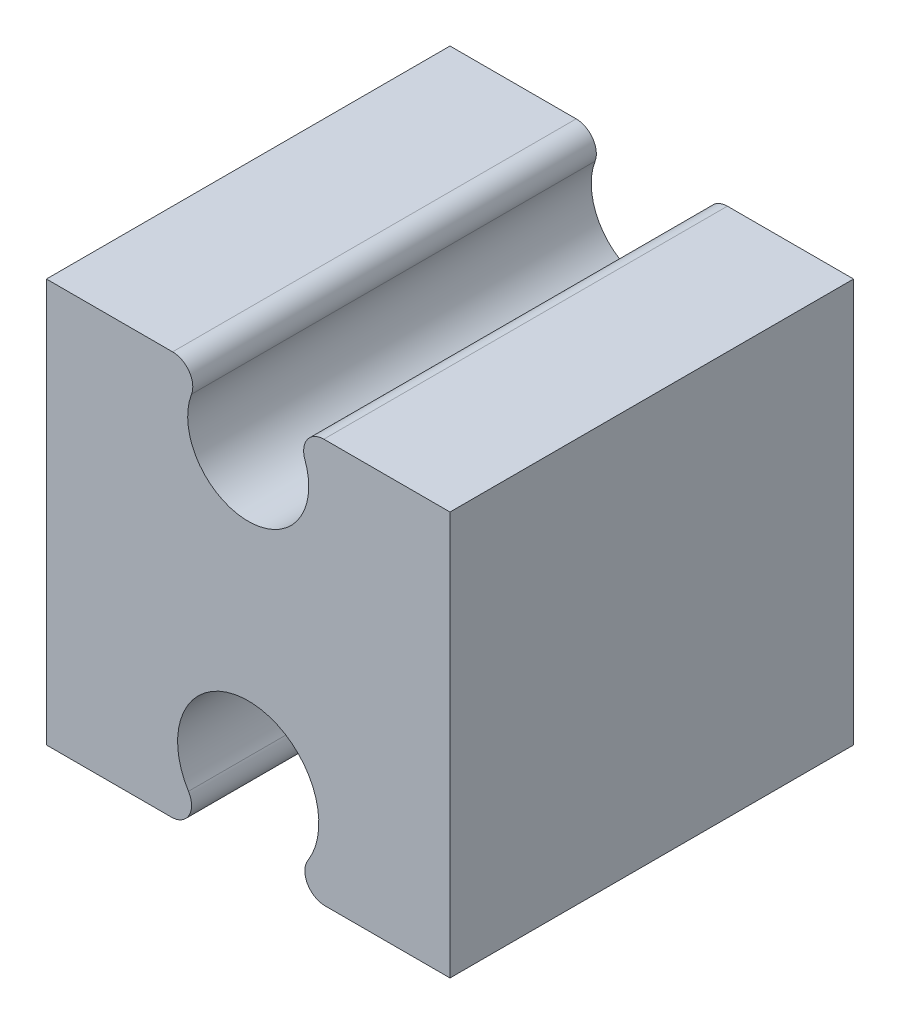
ISO-10303-21;
HEADER;
FILE_DESCRIPTION(('STEP AP214'),'2;1');
FILE_NAME('part.step','',(''),(''),'','','');
FILE_SCHEMA(('AUTOMOTIVE_DESIGN { 1 0 10303 214 1 1 1 1 }'));
ENDSEC;
DATA;
#1=APPLICATION_CONTEXT('core data for automotive mechanical design processes');
#2=APPLICATION_PROTOCOL_DEFINITION('international standard','automotive_design',2000,#1);
#3=PRODUCT_CONTEXT('',#1,'mechanical');
#4=PRODUCT('Part','Part','',(#3));
#5=PRODUCT_RELATED_PRODUCT_CATEGORY('part','',(#4));
#6=PRODUCT_DEFINITION_FORMATION('','',#4);
#7=PRODUCT_DEFINITION_CONTEXT('part definition',#1,'design');
#8=PRODUCT_DEFINITION('design','',#6,#7);
#9=PRODUCT_DEFINITION_SHAPE('','',#8);
#10=(LENGTH_UNIT() NAMED_UNIT(*) SI_UNIT(.MILLI.,.METRE.));
#11=(NAMED_UNIT(*) PLANE_ANGLE_UNIT() SI_UNIT($,.RADIAN.));
#12=(NAMED_UNIT(*) SI_UNIT($,.STERADIAN.) SOLID_ANGLE_UNIT());
#13=UNCERTAINTY_MEASURE_WITH_UNIT(LENGTH_MEASURE(1.E-05),#10,'distance_accuracy_value','');
#14=(GEOMETRIC_REPRESENTATION_CONTEXT(3) GLOBAL_UNCERTAINTY_ASSIGNED_CONTEXT((#13)) GLOBAL_UNIT_ASSIGNED_CONTEXT((#10,
#11,#12)) REPRESENTATION_CONTEXT('',''));
#15=CARTESIAN_POINT('',(0.,0.,0.));
#16=DIRECTION('',(0.,0.,1.));
#17=DIRECTION('',(1.,0.,0.));
#18=AXIS2_PLACEMENT_3D('',#15,#16,#17);
#19=CARTESIAN_POINT('',(5.,-8.3,10.));
#20=DIRECTION('',(0.,0.,-1.));
#21=DIRECTION('',(-1.,0.,0.));
#22=AXIS2_PLACEMENT_3D('',#19,#20,#21);
#23=CYLINDRICAL_SURFACE('',#22,1.75);
#24=CARTESIAN_POINT('',(5.,-8.3,0.));
#25=DIRECTION('',(0.,0.,1.));
#26=DIRECTION('',(1.,0.,0.));
#27=AXIS2_PLACEMENT_3D('',#24,#25,#26);
#28=CIRCLE('',#27,1.75);
#29=CARTESIAN_POINT('',(6.48033404638578,-9.23333333333333,0.));
#30=VERTEX_POINT('',#29);
#31=CARTESIAN_POINT('',(3.51966595361422,-9.23333333333333,0.));
#32=VERTEX_POINT('',#31);
#33=EDGE_CURVE('E173',#30,#32,#28,.T.);
#34=ORIENTED_EDGE('',*,*,#33,.F.);
#35=DIRECTION('',(0.,0.,-1.));
#36=VECTOR('',#35,1.);
#37=CARTESIAN_POINT('',(6.48033404638578,-9.23333333333333,10.));
#38=LINE('',#37,#36);
#39=CARTESIAN_POINT('',(6.48033404638578,-9.23333333333333,10.));
#40=VERTEX_POINT('',#39);
#41=EDGE_CURVE('E206',#30,#40,#38,.F.);
#42=ORIENTED_EDGE('',*,*,#41,.T.);
#43=CARTESIAN_POINT('',(5.,-8.3,10.));
#44=DIRECTION('',(0.,0.,1.));
#45=DIRECTION('',(1.,0.,0.));
#46=AXIS2_PLACEMENT_3D('',#43,#44,#45);
#47=CIRCLE('',#46,1.75);
#48=CARTESIAN_POINT('',(3.51966595361422,-9.23333333333333,10.));
#49=VERTEX_POINT('',#48);
#50=EDGE_CURVE('E145',#40,#49,#47,.T.);
#51=ORIENTED_EDGE('',*,*,#50,.T.);
#52=DIRECTION('',(0.,0.,-1.));
#53=VECTOR('',#52,1.);
#54=CARTESIAN_POINT('',(3.51966595361422,-9.23333333333333,10.));
#55=LINE('',#54,#53);
#56=EDGE_CURVE('E203',#49,#32,#55,.T.);
#57=ORIENTED_EDGE('',*,*,#56,.T.);
#58=EDGE_LOOP('',(#34,#42,#51,#57));
#59=FACE_BOUND('',#58,.T.);
#60=ADVANCED_FACE('F41',(#59),#23,.F.);
#61=CARTESIAN_POINT('',(0.,-10.,10.));
#62=DIRECTION('',(0.,1.,0.));
#63=DIRECTION('',(0.,0.,1.));
#64=AXIS2_PLACEMENT_3D('',#61,#62,#63);
#65=PLANE('',#64);
#66=DIRECTION('',(1.,0.,0.));
#67=VECTOR('',#66,1.);
#68=CARTESIAN_POINT('',(0.,-10.,10.));
#69=LINE('',#68,#67);
#70=CARTESIAN_POINT('',(6.90328663106743,-10.,10.));
#71=VERTEX_POINT('',#70);
#72=CARTESIAN_POINT('',(10.,-10.,10.));
#73=VERTEX_POINT('',#72);
#74=EDGE_CURVE('E133',#71,#73,#69,.T.);
#75=ORIENTED_EDGE('',*,*,#74,.F.);
#76=DIRECTION('',(0.,0.,1.));
#77=VECTOR('',#76,1.);
#78=CARTESIAN_POINT('',(6.90328663106743,-10.,0.));
#79=LINE('',#78,#77);
#80=CARTESIAN_POINT('',(6.90328663106743,-10.,0.));
#81=VERTEX_POINT('',#80);
#82=EDGE_CURVE('E156',#71,#81,#79,.F.);
#83=ORIENTED_EDGE('',*,*,#82,.T.);
#84=DIRECTION('',(1.,0.,0.));
#85=VECTOR('',#84,1.);
#86=CARTESIAN_POINT('',(0.,-10.,0.));
#87=LINE('',#86,#85);
#88=CARTESIAN_POINT('',(10.,-10.,0.));
#89=VERTEX_POINT('',#88);
#90=EDGE_CURVE('E152',#81,#89,#87,.T.);
#91=ORIENTED_EDGE('',*,*,#90,.T.);
#92=DIRECTION('',(0.,0.,-1.));
#93=VECTOR('',#92,1.);
#94=CARTESIAN_POINT('',(10.,-10.,10.));
#95=LINE('',#94,#93);
#96=EDGE_CURVE('E149',#73,#89,#95,.T.);
#97=ORIENTED_EDGE('',*,*,#96,.F.);
#98=EDGE_LOOP('',(#75,#83,#91,#97));
#99=FACE_BOUND('',#98,.T.);
#100=ADVANCED_FACE('F150',(#99),#65,.F.);
#101=CARTESIAN_POINT('',(10.,0.,10.));
#102=DIRECTION('',(1.,0.,0.));
#103=DIRECTION('',(0.,1.,0.));
#104=AXIS2_PLACEMENT_3D('',#101,#102,#103);
#105=PLANE('',#104);
#106=DIRECTION('',(0.,-1.,0.));
#107=VECTOR('',#106,1.);
#108=CARTESIAN_POINT('',(10.,0.,0.));
#109=LINE('',#108,#107);
#110=CARTESIAN_POINT('',(10.,0.,0.));
#111=VERTEX_POINT('',#110);
#112=EDGE_CURVE('E177',#111,#89,#109,.T.);
#113=ORIENTED_EDGE('',*,*,#112,.F.);
#114=DIRECTION('',(0.,0.,-1.));
#115=VECTOR('',#114,1.);
#116=CARTESIAN_POINT('',(10.,0.,10.));
#117=LINE('',#116,#115);
#118=CARTESIAN_POINT('',(10.,0.,10.));
#119=VERTEX_POINT('',#118);
#120=EDGE_CURVE('E157',#119,#111,#117,.T.);
#121=ORIENTED_EDGE('',*,*,#120,.F.);
#122=DIRECTION('',(0.,-1.,0.));
#123=VECTOR('',#122,1.);
#124=CARTESIAN_POINT('',(10.,0.,10.));
#125=LINE('',#124,#123);
#126=EDGE_CURVE('E139',#119,#73,#125,.T.);
#127=ORIENTED_EDGE('',*,*,#126,.T.);
#128=ORIENTED_EDGE('',*,*,#96,.T.);
#129=EDGE_LOOP('',(#113,#121,#127,#128));
#130=FACE_BOUND('',#129,.T.);
#131=ADVANCED_FACE('F160',(#130),#105,.T.);
#132=CARTESIAN_POINT('',(0.,0.,10.));
#133=DIRECTION('',(0.,1.,0.));
#134=DIRECTION('',(-1.,0.,0.));
#135=AXIS2_PLACEMENT_3D('',#132,#133,#134);
#136=PLANE('',#135);
#137=DIRECTION('',(1.,0.,0.));
#138=VECTOR('',#137,1.);
#139=CARTESIAN_POINT('',(0.,0.,0.));
#140=LINE('',#139,#138);
#141=CARTESIAN_POINT('',(6.87349939951952,0.,0.));
#142=VERTEX_POINT('',#141);
#143=EDGE_CURVE('E180',#142,#111,#140,.T.);
#144=ORIENTED_EDGE('',*,*,#143,.F.);
#145=DIRECTION('',(0.,0.,-1.));
#146=VECTOR('',#145,1.);
#147=CARTESIAN_POINT('',(6.87349939951952,0.,10.));
#148=LINE('',#147,#146);
#149=CARTESIAN_POINT('',(6.87349939951952,0.,10.));
#150=VERTEX_POINT('',#149);
#151=EDGE_CURVE('E49',#142,#150,#148,.F.);
#152=ORIENTED_EDGE('',*,*,#151,.T.);
#153=DIRECTION('',(1.,0.,0.));
#154=VECTOR('',#153,1.);
#155=CARTESIAN_POINT('',(0.,0.,10.));
#156=LINE('',#155,#154);
#157=EDGE_CURVE('E162',#150,#119,#156,.T.);
#158=ORIENTED_EDGE('',*,*,#157,.T.);
#159=ORIENTED_EDGE('',*,*,#120,.T.);
#160=EDGE_LOOP('',(#144,#152,#158,#159));
#161=FACE_BOUND('',#160,.T.);
#162=ADVANCED_FACE('F222',(#161),#136,.T.);
#163=CARTESIAN_POINT('',(5.,-1.2,10.));
#164=DIRECTION('',(0.,0.,-1.));
#165=DIRECTION('',(-1.,0.,0.));
#166=AXIS2_PLACEMENT_3D('',#163,#164,#165);
#167=CYLINDRICAL_SURFACE('',#166,1.5);
#168=CARTESIAN_POINT('',(5.,-1.2,10.));
#169=DIRECTION('',(0.,0.,1.));
#170=DIRECTION('',(1.,0.,0.));
#171=AXIS2_PLACEMENT_3D('',#168,#169,#170);
#172=CIRCLE('',#171,1.5);
#173=CARTESIAN_POINT('',(3.59487545036036,-0.675,10.));
#174=VERTEX_POINT('',#173);
#175=CARTESIAN_POINT('',(6.40512454963964,-0.675,10.));
#176=VERTEX_POINT('',#175);
#177=EDGE_CURVE('E164',#174,#176,#172,.T.);
#178=ORIENTED_EDGE('',*,*,#177,.T.);
#179=DIRECTION('',(0.,0.,-1.));
#180=VECTOR('',#179,1.);
#181=CARTESIAN_POINT('',(6.40512454963964,-0.675,10.));
#182=LINE('',#181,#180);
#183=CARTESIAN_POINT('',(6.40512454963964,-0.675,0.));
#184=VERTEX_POINT('',#183);
#185=EDGE_CURVE('E217',#176,#184,#182,.T.);
#186=ORIENTED_EDGE('',*,*,#185,.T.);
#187=CARTESIAN_POINT('',(5.,-1.2,0.));
#188=DIRECTION('',(0.,0.,1.));
#189=DIRECTION('',(1.,0.,0.));
#190=AXIS2_PLACEMENT_3D('',#187,#188,#189);
#191=CIRCLE('',#190,1.5);
#192=CARTESIAN_POINT('',(3.59487545036036,-0.675,0.));
#193=VERTEX_POINT('',#192);
#194=EDGE_CURVE('E182',#193,#184,#191,.T.);
#195=ORIENTED_EDGE('',*,*,#194,.F.);
#196=DIRECTION('',(0.,0.,-1.));
#197=VECTOR('',#196,1.);
#198=CARTESIAN_POINT('',(3.59487545036036,-0.675,10.));
#199=LINE('',#198,#197);
#200=EDGE_CURVE('E215',#193,#174,#199,.F.);
#201=ORIENTED_EDGE('',*,*,#200,.T.);
#202=EDGE_LOOP('',(#178,#186,#195,#201));
#203=FACE_BOUND('',#202,.T.);
#204=ADVANCED_FACE('F229',(#203),#167,.F.);
#205=CARTESIAN_POINT('',(0.,0.,10.));
#206=VERTEX_POINT('',#205);
#207=CARTESIAN_POINT('',(3.12650060048048,0.,10.));
#208=VERTEX_POINT('',#207);
#209=EDGE_CURVE('E166',#206,#208,#156,.T.);
#210=ORIENTED_EDGE('',*,*,#209,.T.);
#211=DIRECTION('',(0.,0.,-1.));
#212=VECTOR('',#211,1.);
#213=CARTESIAN_POINT('',(3.12650060048048,0.,10.));
#214=LINE('',#213,#212);
#215=CARTESIAN_POINT('',(3.12650060048048,0.,0.));
#216=VERTEX_POINT('',#215);
#217=EDGE_CURVE('E11',#208,#216,#214,.T.);
#218=ORIENTED_EDGE('',*,*,#217,.T.);
#219=CARTESIAN_POINT('',(0.,0.,0.));
#220=VERTEX_POINT('',#219);
#221=EDGE_CURVE('E183',#220,#216,#140,.T.);
#222=ORIENTED_EDGE('',*,*,#221,.F.);
#223=DIRECTION('',(0.,0.,-1.));
#224=VECTOR('',#223,1.);
#225=CARTESIAN_POINT('',(0.,0.,10.));
#226=LINE('',#225,#224);
#227=EDGE_CURVE('E191',#206,#220,#226,.T.);
#228=ORIENTED_EDGE('',*,*,#227,.F.);
#229=EDGE_LOOP('',(#210,#218,#222,#228));
#230=FACE_BOUND('',#229,.T.);
#231=ADVANCED_FACE('F239',(#230),#136,.T.);
#232=CARTESIAN_POINT('',(0.,0.,10.));
#233=DIRECTION('',(1.,0.,0.));
#234=DIRECTION('',(0.,1.,0.));
#235=AXIS2_PLACEMENT_3D('',#232,#233,#234);
#236=PLANE('',#235);
#237=DIRECTION('',(0.,-1.,0.));
#238=VECTOR('',#237,1.);
#239=CARTESIAN_POINT('',(0.,0.,0.));
#240=LINE('',#239,#238);
#241=CARTESIAN_POINT('',(0.,-10.,0.));
#242=VERTEX_POINT('',#241);
#243=EDGE_CURVE('E186',#220,#242,#240,.T.);
#244=ORIENTED_EDGE('',*,*,#243,.T.);
#245=DIRECTION('',(0.,0.,-1.));
#246=VECTOR('',#245,1.);
#247=CARTESIAN_POINT('',(0.,-10.,10.));
#248=LINE('',#247,#246);
#249=CARTESIAN_POINT('',(0.,-10.,10.));
#250=VERTEX_POINT('',#249);
#251=EDGE_CURVE('E188',#250,#242,#248,.T.);
#252=ORIENTED_EDGE('',*,*,#251,.F.);
#253=DIRECTION('',(0.,-1.,0.));
#254=VECTOR('',#253,1.);
#255=CARTESIAN_POINT('',(0.,0.,10.));
#256=LINE('',#255,#254);
#257=EDGE_CURVE('E171',#206,#250,#256,.T.);
#258=ORIENTED_EDGE('',*,*,#257,.F.);
#259=ORIENTED_EDGE('',*,*,#227,.T.);
#260=EDGE_LOOP('',(#244,#252,#258,#259));
#261=FACE_BOUND('',#260,.T.);
#262=ADVANCED_FACE('F244',(#261),#236,.F.);
#263=CARTESIAN_POINT('',(3.09671336893257,-10.,0.));
#264=VERTEX_POINT('',#263);
#265=EDGE_CURVE('E178',#242,#264,#87,.T.);
#266=ORIENTED_EDGE('',*,*,#265,.T.);
#267=DIRECTION('',(0.,0.,1.));
#268=VECTOR('',#267,1.);
#269=CARTESIAN_POINT('',(3.09671336893257,-10.,10.));
#270=LINE('',#269,#268);
#271=CARTESIAN_POINT('',(3.09671336893257,-10.,10.));
#272=VERTEX_POINT('',#271);
#273=EDGE_CURVE('E56',#264,#272,#270,.T.);
#274=ORIENTED_EDGE('',*,*,#273,.T.);
#275=EDGE_CURVE('E147',#250,#272,#69,.T.);
#276=ORIENTED_EDGE('',*,*,#275,.F.);
#277=ORIENTED_EDGE('',*,*,#251,.T.);
#278=EDGE_LOOP('',(#266,#274,#276,#277));
#279=FACE_BOUND('',#278,.T.);
#280=ADVANCED_FACE('F246',(#279),#65,.F.);
#281=CARTESIAN_POINT('',(0.,0.,10.));
#282=DIRECTION('',(0.,0.,1.));
#283=DIRECTION('',(1.,0.,0.));
#284=AXIS2_PLACEMENT_3D('',#281,#282,#283);
#285=PLANE('',#284);
#286=ORIENTED_EDGE('',*,*,#50,.F.);
#287=CARTESIAN_POINT('',(6.90328663106743,-9.5,10.));
#288=DIRECTION('',(0.,0.,1.));
#289=DIRECTION('',(1.,0.,0.));
#290=AXIS2_PLACEMENT_3D('',#287,#288,#289);
#291=CIRCLE('',#290,0.5);
#292=EDGE_CURVE('E141',#40,#71,#291,.T.);
#293=ORIENTED_EDGE('',*,*,#292,.T.);
#294=ORIENTED_EDGE('',*,*,#74,.T.);
#295=ORIENTED_EDGE('',*,*,#126,.F.);
#296=ORIENTED_EDGE('',*,*,#157,.F.);
#297=CARTESIAN_POINT('',(6.87349939951952,-0.5,10.));
#298=DIRECTION('',(0.,0.,1.));
#299=DIRECTION('',(1.,0.,0.));
#300=AXIS2_PLACEMENT_3D('',#297,#298,#299);
#301=CIRCLE('',#300,0.5);
#302=EDGE_CURVE('E209',#150,#176,#301,.T.);
#303=ORIENTED_EDGE('',*,*,#302,.T.);
#304=ORIENTED_EDGE('',*,*,#177,.F.);
#305=CARTESIAN_POINT('',(3.12650060048048,-0.5,10.));
#306=DIRECTION('',(0.,0.,1.));
#307=DIRECTION('',(1.,0.,0.));
#308=AXIS2_PLACEMENT_3D('',#305,#306,#307);
#309=CIRCLE('',#308,0.5);
#310=EDGE_CURVE('E64',#174,#208,#309,.T.);
#311=ORIENTED_EDGE('',*,*,#310,.T.);
#312=ORIENTED_EDGE('',*,*,#209,.F.);
#313=ORIENTED_EDGE('',*,*,#257,.T.);
#314=ORIENTED_EDGE('',*,*,#275,.T.);
#315=CARTESIAN_POINT('',(3.09671336893257,-9.5,10.));
#316=DIRECTION('',(0.,0.,1.));
#317=DIRECTION('',(1.,0.,0.));
#318=AXIS2_PLACEMENT_3D('',#315,#316,#317);
#319=CIRCLE('',#318,0.5);
#320=EDGE_CURVE('E211',#272,#49,#319,.T.);
#321=ORIENTED_EDGE('',*,*,#320,.T.);
#322=EDGE_LOOP('',(#286,#293,#294,#295,#296,#303,#304,#311,#312,#313,#314,#321));
#323=FACE_BOUND('',#322,.T.);
#324=ADVANCED_FACE('F136',(#323),#285,.T.);
#325=CARTESIAN_POINT('',(0.,0.,0.));
#326=DIRECTION('',(0.,0.,1.));
#327=DIRECTION('',(1.,0.,0.));
#328=AXIS2_PLACEMENT_3D('',#325,#326,#327);
#329=PLANE('',#328);
#330=ORIENTED_EDGE('',*,*,#90,.F.);
#331=CARTESIAN_POINT('',(6.90328663106743,-9.5,0.));
#332=DIRECTION('',(0.,0.,1.));
#333=DIRECTION('',(1.,0.,0.));
#334=AXIS2_PLACEMENT_3D('',#331,#332,#333);
#335=CIRCLE('',#334,0.5);
#336=EDGE_CURVE('E201',#81,#30,#335,.F.);
#337=ORIENTED_EDGE('',*,*,#336,.T.);
#338=ORIENTED_EDGE('',*,*,#33,.T.);
#339=CARTESIAN_POINT('',(3.09671336893257,-9.5,0.));
#340=DIRECTION('',(0.,0.,1.));
#341=DIRECTION('',(1.,0.,0.));
#342=AXIS2_PLACEMENT_3D('',#339,#340,#341);
#343=CIRCLE('',#342,0.5);
#344=EDGE_CURVE('E199',#32,#264,#343,.F.);
#345=ORIENTED_EDGE('',*,*,#344,.T.);
#346=ORIENTED_EDGE('',*,*,#265,.F.);
#347=ORIENTED_EDGE('',*,*,#243,.F.);
#348=ORIENTED_EDGE('',*,*,#221,.T.);
#349=CARTESIAN_POINT('',(3.12650060048048,-0.5,0.));
#350=DIRECTION('',(0.,0.,1.));
#351=DIRECTION('',(1.,0.,0.));
#352=AXIS2_PLACEMENT_3D('',#349,#350,#351);
#353=CIRCLE('',#352,0.5);
#354=EDGE_CURVE('E195',#216,#193,#353,.F.);
#355=ORIENTED_EDGE('',*,*,#354,.T.);
#356=ORIENTED_EDGE('',*,*,#194,.T.);
#357=CARTESIAN_POINT('',(6.87349939951952,-0.5,0.));
#358=DIRECTION('',(0.,0.,1.));
#359=DIRECTION('',(1.,0.,0.));
#360=AXIS2_PLACEMENT_3D('',#357,#358,#359);
#361=CIRCLE('',#360,0.5);
#362=EDGE_CURVE('E197',#184,#142,#361,.F.);
#363=ORIENTED_EDGE('',*,*,#362,.T.);
#364=ORIENTED_EDGE('',*,*,#143,.T.);
#365=ORIENTED_EDGE('',*,*,#112,.T.);
#366=EDGE_LOOP('',(#330,#337,#338,#345,#346,#347,#348,#355,#356,#363,#364,#365));
#367=FACE_BOUND('',#366,.T.);
#368=ADVANCED_FACE('F232',(#367),#329,.F.);
#369=CARTESIAN_POINT('',(6.90328663106743,-9.5,10.));
#370=DIRECTION('',(0.,0.,-1.));
#371=DIRECTION('',(-1.,0.,0.));
#372=AXIS2_PLACEMENT_3D('',#369,#370,#371);
#373=CYLINDRICAL_SURFACE('',#372,0.5);
#374=ORIENTED_EDGE('',*,*,#292,.F.);
#375=ORIENTED_EDGE('',*,*,#41,.F.);
#376=ORIENTED_EDGE('',*,*,#336,.F.);
#377=ORIENTED_EDGE('',*,*,#82,.F.);
#378=EDGE_LOOP('',(#374,#375,#376,#377));
#379=FACE_BOUND('',#378,.T.);
#380=ADVANCED_FACE('F267',(#379),#373,.T.);
#381=CARTESIAN_POINT('',(3.09671336893257,-9.5,10.));
#382=DIRECTION('',(0.,0.,-1.));
#383=DIRECTION('',(-1.,0.,0.));
#384=AXIS2_PLACEMENT_3D('',#381,#382,#383);
#385=CYLINDRICAL_SURFACE('',#384,0.5);
#386=ORIENTED_EDGE('',*,*,#320,.F.);
#387=ORIENTED_EDGE('',*,*,#273,.F.);
#388=ORIENTED_EDGE('',*,*,#344,.F.);
#389=ORIENTED_EDGE('',*,*,#56,.F.);
#390=EDGE_LOOP('',(#386,#387,#388,#389));
#391=FACE_BOUND('',#390,.T.);
#392=ADVANCED_FACE('F270',(#391),#385,.T.);
#393=CARTESIAN_POINT('',(6.87349939951952,-0.5,10.));
#394=DIRECTION('',(0.,0.,-1.));
#395=DIRECTION('',(-1.,0.,0.));
#396=AXIS2_PLACEMENT_3D('',#393,#394,#395);
#397=CYLINDRICAL_SURFACE('',#396,0.5);
#398=ORIENTED_EDGE('',*,*,#302,.F.);
#399=ORIENTED_EDGE('',*,*,#151,.F.);
#400=ORIENTED_EDGE('',*,*,#362,.F.);
#401=ORIENTED_EDGE('',*,*,#185,.F.);
#402=EDGE_LOOP('',(#398,#399,#400,#401));
#403=FACE_BOUND('',#402,.T.);
#404=ADVANCED_FACE('F226',(#403),#397,.T.);
#405=CARTESIAN_POINT('',(3.12650060048048,-0.5,10.));
#406=DIRECTION('',(0.,0.,-1.));
#407=DIRECTION('',(-1.,0.,0.));
#408=AXIS2_PLACEMENT_3D('',#405,#406,#407);
#409=CYLINDRICAL_SURFACE('',#408,0.5);
#410=ORIENTED_EDGE('',*,*,#310,.F.);
#411=ORIENTED_EDGE('',*,*,#200,.F.);
#412=ORIENTED_EDGE('',*,*,#354,.F.);
#413=ORIENTED_EDGE('',*,*,#217,.F.);
#414=EDGE_LOOP('',(#410,#411,#412,#413));
#415=FACE_BOUND('',#414,.T.);
#416=ADVANCED_FACE('F43',(#415),#409,.T.);
#417=CLOSED_SHELL('',(#60,#100,#131,#162,#204,#231,#262,#280,#324,#368,#380,#392,#404,#416));
#418=MANIFOLD_SOLID_BREP('B2',#417);
#419=ADVANCED_BREP_SHAPE_REPRESENTATION('',(#18,#418),#14);
#420=SHAPE_DEFINITION_REPRESENTATION(#9,#419);
ENDSEC;
END-ISO-10303-21;
